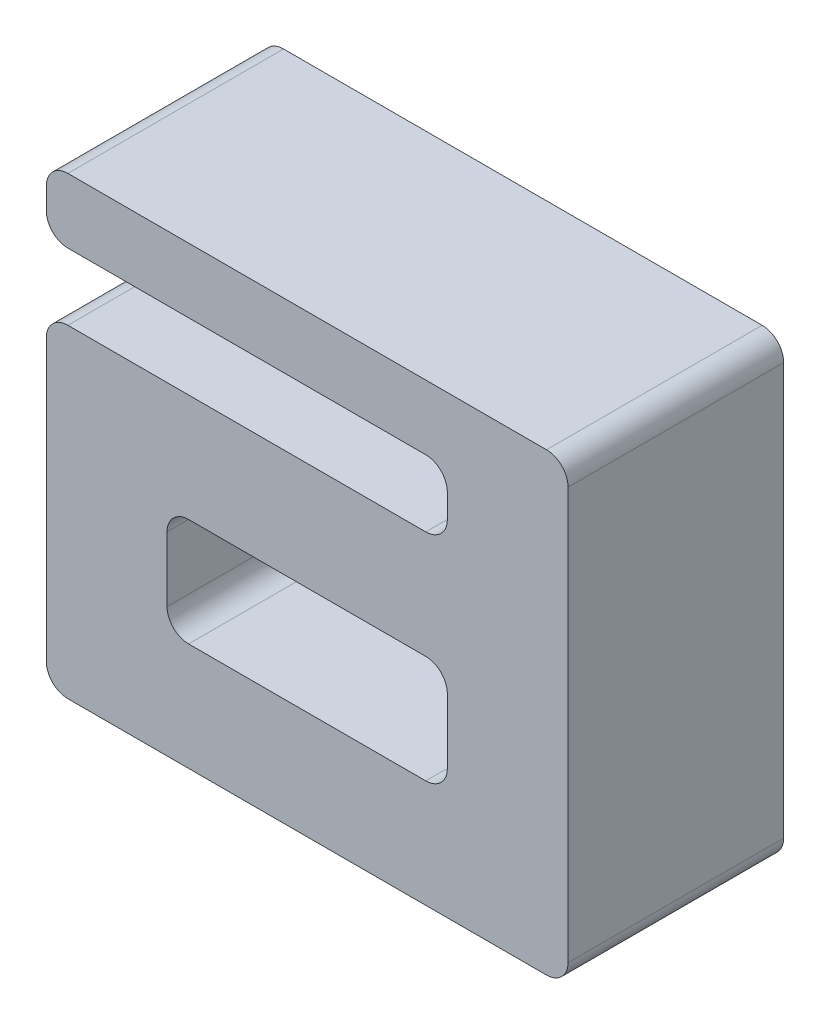
ISO-10303-21;
HEADER;
FILE_DESCRIPTION(('STEP AP214'),'2;1');
FILE_NAME('part.step','',(''),(''),'','','');
FILE_SCHEMA(('AUTOMOTIVE_DESIGN { 1 0 10303 214 1 1 1 1 }'));
ENDSEC;
DATA;
#1=APPLICATION_CONTEXT('core data for automotive mechanical design processes');
#2=APPLICATION_PROTOCOL_DEFINITION('international standard','automotive_design',2000,#1);
#3=PRODUCT_CONTEXT('',#1,'mechanical');
#4=PRODUCT('Part','Part','',(#3));
#5=PRODUCT_RELATED_PRODUCT_CATEGORY('part','',(#4));
#6=PRODUCT_DEFINITION_FORMATION('','',#4);
#7=PRODUCT_DEFINITION_CONTEXT('part definition',#1,'design');
#8=PRODUCT_DEFINITION('design','',#6,#7);
#9=PRODUCT_DEFINITION_SHAPE('','',#8);
#10=(LENGTH_UNIT() NAMED_UNIT(*) SI_UNIT(.MILLI.,.METRE.));
#11=(NAMED_UNIT(*) PLANE_ANGLE_UNIT() SI_UNIT($,.RADIAN.));
#12=(NAMED_UNIT(*) SI_UNIT($,.STERADIAN.) SOLID_ANGLE_UNIT());
#13=UNCERTAINTY_MEASURE_WITH_UNIT(LENGTH_MEASURE(1.E-05),#10,'distance_accuracy_value','');
#14=(GEOMETRIC_REPRESENTATION_CONTEXT(3) GLOBAL_UNCERTAINTY_ASSIGNED_CONTEXT((#13)) GLOBAL_UNIT_ASSIGNED_CONTEXT((#10,
#11,#12)) REPRESENTATION_CONTEXT('',''));
#15=CARTESIAN_POINT('',(0.,0.,0.));
#16=DIRECTION('',(0.,0.,1.));
#17=DIRECTION('',(1.,0.,0.));
#18=AXIS2_PLACEMENT_3D('',#15,#16,#17);
#19=CARTESIAN_POINT('',(0.,0.,5.));
#20=DIRECTION('',(0.,0.,-1.));
#21=DIRECTION('',(-1.,0.,0.));
#22=AXIS2_PLACEMENT_3D('',#19,#20,#21);
#23=PLANE('',#22);
#24=DIRECTION('',(0.,-1.,0.));
#25=VECTOR('',#24,1.);
#26=CARTESIAN_POINT('',(-6.05,-3.75,5.));
#27=LINE('',#26,#25);
#28=CARTESIAN_POINT('',(-6.05,3.25,5.));
#29=VERTEX_POINT('',#28);
#30=CARTESIAN_POINT('',(-6.05,-3.25,5.));
#31=VERTEX_POINT('',#30);
#32=EDGE_CURVE('E246',#29,#31,#27,.T.);
#33=ORIENTED_EDGE('',*,*,#32,.T.);
#34=CARTESIAN_POINT('',(-5.55,-3.25,5.));
#35=DIRECTION('',(0.,0.,-1.));
#36=DIRECTION('',(-1.,0.,0.));
#37=AXIS2_PLACEMENT_3D('',#34,#35,#36);
#38=CIRCLE('',#37,0.5);
#39=CARTESIAN_POINT('',(-5.55,-3.75,5.));
#40=VERTEX_POINT('',#39);
#41=EDGE_CURVE('E270',#31,#40,#38,.F.);
#42=ORIENTED_EDGE('',*,*,#41,.T.);
#43=DIRECTION('',(1.,0.,0.));
#44=VECTOR('',#43,1.);
#45=CARTESIAN_POINT('',(-6.05,-3.75,5.));
#46=LINE('',#45,#44);
#47=CARTESIAN_POINT('',(5.55,-3.75,5.));
#48=VERTEX_POINT('',#47);
#49=EDGE_CURVE('E215',#40,#48,#46,.T.);
#50=ORIENTED_EDGE('',*,*,#49,.T.);
#51=CARTESIAN_POINT('',(5.55,-3.25,5.));
#52=DIRECTION('',(0.,0.,-1.));
#53=DIRECTION('',(-1.,0.,0.));
#54=AXIS2_PLACEMENT_3D('',#51,#52,#53);
#55=CIRCLE('',#54,0.5);
#56=CARTESIAN_POINT('',(6.05,-3.25,5.));
#57=VERTEX_POINT('',#56);
#58=EDGE_CURVE('E268',#48,#57,#55,.F.);
#59=ORIENTED_EDGE('',*,*,#58,.T.);
#60=DIRECTION('',(0.,1.,0.));
#61=VECTOR('',#60,1.);
#62=CARTESIAN_POINT('',(6.05,-3.75,5.));
#63=LINE('',#62,#61);
#64=CARTESIAN_POINT('',(6.05,6.3,5.));
#65=VERTEX_POINT('',#64);
#66=EDGE_CURVE('E379',#57,#65,#63,.T.);
#67=ORIENTED_EDGE('',*,*,#66,.T.);
#68=CARTESIAN_POINT('',(5.55,6.3,5.));
#69=DIRECTION('',(0.,0.,-1.));
#70=DIRECTION('',(-1.,0.,0.));
#71=AXIS2_PLACEMENT_3D('',#68,#69,#70);
#72=CIRCLE('',#71,0.5);
#73=CARTESIAN_POINT('',(5.54999999999999,6.8,5.));
#74=VERTEX_POINT('',#73);
#75=EDGE_CURVE('E266',#65,#74,#72,.F.);
#76=ORIENTED_EDGE('',*,*,#75,.T.);
#77=DIRECTION('',(-1.,0.,0.));
#78=VECTOR('',#77,1.);
#79=CARTESIAN_POINT('',(-6.05,6.8,5.));
#80=LINE('',#79,#78);
#81=CARTESIAN_POINT('',(-5.55,6.8,5.));
#82=VERTEX_POINT('',#81);
#83=EDGE_CURVE('E382',#74,#82,#80,.T.);
#84=ORIENTED_EDGE('',*,*,#83,.T.);
#85=CARTESIAN_POINT('',(-5.55,6.3,5.));
#86=DIRECTION('',(0.,0.,-1.));
#87=DIRECTION('',(-1.,0.,0.));
#88=AXIS2_PLACEMENT_3D('',#85,#86,#87);
#89=CIRCLE('',#88,0.5);
#90=CARTESIAN_POINT('',(-6.05,6.3,5.));
#91=VERTEX_POINT('',#90);
#92=EDGE_CURVE('E264',#82,#91,#89,.F.);
#93=ORIENTED_EDGE('',*,*,#92,.T.);
#94=DIRECTION('',(0.,-1.,0.));
#95=VECTOR('',#94,1.);
#96=CARTESIAN_POINT('',(-6.05,5.3,5.));
#97=LINE('',#96,#95);
#98=CARTESIAN_POINT('',(-6.05,5.8,5.));
#99=VERTEX_POINT('',#98);
#100=EDGE_CURVE('E385',#91,#99,#97,.T.);
#101=ORIENTED_EDGE('',*,*,#100,.T.);
#102=CARTESIAN_POINT('',(-5.55,5.8,5.));
#103=DIRECTION('',(0.,0.,-1.));
#104=DIRECTION('',(-1.,0.,0.));
#105=AXIS2_PLACEMENT_3D('',#102,#103,#104);
#106=CIRCLE('',#105,0.5);
#107=CARTESIAN_POINT('',(-5.55,5.3,5.));
#108=VERTEX_POINT('',#107);
#109=EDGE_CURVE('E260',#99,#108,#106,.F.);
#110=ORIENTED_EDGE('',*,*,#109,.T.);
#111=DIRECTION('',(1.,0.,0.));
#112=VECTOR('',#111,1.);
#113=CARTESIAN_POINT('',(-6.05,5.3,5.));
#114=LINE('',#113,#112);
#115=CARTESIAN_POINT('',(2.75,5.3,5.));
#116=VERTEX_POINT('',#115);
#117=EDGE_CURVE('E388',#108,#116,#114,.T.);
#118=ORIENTED_EDGE('',*,*,#117,.T.);
#119=CARTESIAN_POINT('',(2.75,4.8,5.));
#120=DIRECTION('',(0.,0.,-1.));
#121=DIRECTION('',(-1.,0.,0.));
#122=AXIS2_PLACEMENT_3D('',#119,#120,#121);
#123=CIRCLE('',#122,0.5);
#124=CARTESIAN_POINT('',(3.25,4.8,5.));
#125=VERTEX_POINT('',#124);
#126=EDGE_CURVE('E327',#116,#125,#123,.T.);
#127=ORIENTED_EDGE('',*,*,#126,.T.);
#128=DIRECTION('',(0.,-1.,0.));
#129=VECTOR('',#128,1.);
#130=CARTESIAN_POINT('',(3.25,5.3,5.));
#131=LINE('',#130,#129);
#132=CARTESIAN_POINT('',(3.25,4.25,5.));
#133=VERTEX_POINT('',#132);
#134=EDGE_CURVE('E391',#125,#133,#131,.T.);
#135=ORIENTED_EDGE('',*,*,#134,.T.);
#136=CARTESIAN_POINT('',(2.75,4.25,5.));
#137=DIRECTION('',(0.,0.,-1.));
#138=DIRECTION('',(-1.,0.,0.));
#139=AXIS2_PLACEMENT_3D('',#136,#137,#138);
#140=CIRCLE('',#139,0.5);
#141=CARTESIAN_POINT('',(2.75,3.75,5.));
#142=VERTEX_POINT('',#141);
#143=EDGE_CURVE('E323',#133,#142,#140,.T.);
#144=ORIENTED_EDGE('',*,*,#143,.T.);
#145=DIRECTION('',(-1.,0.,0.));
#146=VECTOR('',#145,1.);
#147=CARTESIAN_POINT('',(-6.05,3.75,5.));
#148=LINE('',#147,#146);
#149=CARTESIAN_POINT('',(-5.55,3.75,5.));
#150=VERTEX_POINT('',#149);
#151=EDGE_CURVE('E247',#142,#150,#148,.T.);
#152=ORIENTED_EDGE('',*,*,#151,.T.);
#153=CARTESIAN_POINT('',(-5.55,3.25,5.));
#154=DIRECTION('',(0.,0.,-1.));
#155=DIRECTION('',(-1.,0.,0.));
#156=AXIS2_PLACEMENT_3D('',#153,#154,#155);
#157=CIRCLE('',#156,0.5);
#158=EDGE_CURVE('E262',#150,#29,#157,.F.);
#159=ORIENTED_EDGE('',*,*,#158,.T.);
#160=EDGE_LOOP('',(#33,#42,#50,#59,#67,#76,#84,#93,#101,#110,#118,#127,#135,#144,#152,#159));
#161=FACE_BOUND('',#160,.T.);
#162=DIRECTION('',(0.,-1.,0.));
#163=VECTOR('',#162,1.);
#164=CARTESIAN_POINT('',(-3.25,-1.25,5.));
#165=LINE('',#164,#163);
#166=CARTESIAN_POINT('',(-3.25,0.75,5.));
#167=VERTEX_POINT('',#166);
#168=CARTESIAN_POINT('',(-3.25,-0.75,5.));
#169=VERTEX_POINT('',#168);
#170=EDGE_CURVE('E360',#167,#169,#165,.T.);
#171=ORIENTED_EDGE('',*,*,#170,.F.);
#172=CARTESIAN_POINT('',(-2.75,0.75,5.));
#173=DIRECTION('',(0.,0.,-1.));
#174=DIRECTION('',(-1.,0.,0.));
#175=AXIS2_PLACEMENT_3D('',#172,#173,#174);
#176=CIRCLE('',#175,0.5);
#177=CARTESIAN_POINT('',(-2.75,1.25,5.));
#178=VERTEX_POINT('',#177);
#179=EDGE_CURVE('E11',#167,#178,#176,.T.);
#180=ORIENTED_EDGE('',*,*,#179,.T.);
#181=DIRECTION('',(-1.,0.,0.));
#182=VECTOR('',#181,1.);
#183=CARTESIAN_POINT('',(-3.25,1.25,5.));
#184=LINE('',#183,#182);
#185=CARTESIAN_POINT('',(2.75,1.25,5.));
#186=VERTEX_POINT('',#185);
#187=EDGE_CURVE('E228',#186,#178,#184,.T.);
#188=ORIENTED_EDGE('',*,*,#187,.F.);
#189=CARTESIAN_POINT('',(2.75,0.75,5.));
#190=DIRECTION('',(0.,0.,-1.));
#191=DIRECTION('',(-1.,0.,0.));
#192=AXIS2_PLACEMENT_3D('',#189,#190,#191);
#193=CIRCLE('',#192,0.5);
#194=CARTESIAN_POINT('',(3.25,0.75,5.));
#195=VERTEX_POINT('',#194);
#196=EDGE_CURVE('E331',#186,#195,#193,.T.);
#197=ORIENTED_EDGE('',*,*,#196,.T.);
#198=DIRECTION('',(0.,1.,0.));
#199=VECTOR('',#198,1.);
#200=CARTESIAN_POINT('',(3.25,-1.25,5.));
#201=LINE('',#200,#199);
#202=CARTESIAN_POINT('',(3.25,-0.75,5.));
#203=VERTEX_POINT('',#202);
#204=EDGE_CURVE('E364',#203,#195,#201,.T.);
#205=ORIENTED_EDGE('',*,*,#204,.F.);
#206=CARTESIAN_POINT('',(2.75,-0.75,5.));
#207=DIRECTION('',(0.,0.,-1.));
#208=DIRECTION('',(-1.,0.,0.));
#209=AXIS2_PLACEMENT_3D('',#206,#207,#208);
#210=CIRCLE('',#209,0.5);
#211=CARTESIAN_POINT('',(2.75,-1.25,5.));
#212=VERTEX_POINT('',#211);
#213=EDGE_CURVE('E48',#203,#212,#210,.T.);
#214=ORIENTED_EDGE('',*,*,#213,.T.);
#215=DIRECTION('',(1.,0.,0.));
#216=VECTOR('',#215,1.);
#217=CARTESIAN_POINT('',(-3.25,-1.25,5.));
#218=LINE('',#217,#216);
#219=CARTESIAN_POINT('',(-2.75,-1.25,5.));
#220=VERTEX_POINT('',#219);
#221=EDGE_CURVE('E367',#220,#212,#218,.T.);
#222=ORIENTED_EDGE('',*,*,#221,.F.);
#223=CARTESIAN_POINT('',(-2.75,-0.75,5.));
#224=DIRECTION('',(0.,0.,-1.));
#225=DIRECTION('',(-1.,0.,0.));
#226=AXIS2_PLACEMENT_3D('',#223,#224,#225);
#227=CIRCLE('',#226,0.5);
#228=EDGE_CURVE('E338',#220,#169,#227,.T.);
#229=ORIENTED_EDGE('',*,*,#228,.T.);
#230=EDGE_LOOP('',(#171,#180,#188,#197,#205,#214,#222,#229));
#231=FACE_BOUND('',#230,.T.);
#232=ADVANCED_FACE('F33',(#161,#231),#23,.F.);
#233=CARTESIAN_POINT('',(0.,0.,0.));
#234=DIRECTION('',(0.,0.,-1.));
#235=DIRECTION('',(-1.,0.,0.));
#236=AXIS2_PLACEMENT_3D('',#233,#234,#235);
#237=PLANE('',#236);
#238=DIRECTION('',(1.,0.,0.));
#239=VECTOR('',#238,1.);
#240=CARTESIAN_POINT('',(-6.05,-3.75,0.));
#241=LINE('',#240,#239);
#242=CARTESIAN_POINT('',(-5.55,-3.75,0.));
#243=VERTEX_POINT('',#242);
#244=CARTESIAN_POINT('',(5.55,-3.75,0.));
#245=VERTEX_POINT('',#244);
#246=EDGE_CURVE('E212',#243,#245,#241,.T.);
#247=ORIENTED_EDGE('',*,*,#246,.F.);
#248=CARTESIAN_POINT('',(-5.55,-3.25,0.));
#249=DIRECTION('',(0.,0.,-1.));
#250=DIRECTION('',(-1.,0.,0.));
#251=AXIS2_PLACEMENT_3D('',#248,#249,#250);
#252=CIRCLE('',#251,0.5);
#253=CARTESIAN_POINT('',(-6.05,-3.25,0.));
#254=VERTEX_POINT('',#253);
#255=EDGE_CURVE('E195',#243,#254,#252,.T.);
#256=ORIENTED_EDGE('',*,*,#255,.T.);
#257=DIRECTION('',(0.,-1.,0.));
#258=VECTOR('',#257,1.);
#259=CARTESIAN_POINT('',(-6.05,-3.75,0.));
#260=LINE('',#259,#258);
#261=CARTESIAN_POINT('',(-6.05,3.25,0.));
#262=VERTEX_POINT('',#261);
#263=EDGE_CURVE('E223',#262,#254,#260,.T.);
#264=ORIENTED_EDGE('',*,*,#263,.F.);
#265=CARTESIAN_POINT('',(-5.55,3.25,0.));
#266=DIRECTION('',(0.,0.,-1.));
#267=DIRECTION('',(-1.,0.,0.));
#268=AXIS2_PLACEMENT_3D('',#265,#266,#267);
#269=CIRCLE('',#268,0.5);
#270=CARTESIAN_POINT('',(-5.55,3.75,0.));
#271=VERTEX_POINT('',#270);
#272=EDGE_CURVE('E250',#262,#271,#269,.T.);
#273=ORIENTED_EDGE('',*,*,#272,.T.);
#274=DIRECTION('',(-1.,0.,0.));
#275=VECTOR('',#274,1.);
#276=CARTESIAN_POINT('',(-6.05,3.75,0.));
#277=LINE('',#276,#275);
#278=CARTESIAN_POINT('',(2.75,3.75,0.));
#279=VERTEX_POINT('',#278);
#280=EDGE_CURVE('E243',#279,#271,#277,.T.);
#281=ORIENTED_EDGE('',*,*,#280,.F.);
#282=CARTESIAN_POINT('',(2.75,4.25,0.));
#283=DIRECTION('',(0.,0.,-1.));
#284=DIRECTION('',(-1.,0.,0.));
#285=AXIS2_PLACEMENT_3D('',#282,#283,#284);
#286=CIRCLE('',#285,0.5);
#287=CARTESIAN_POINT('',(3.25,4.25,0.));
#288=VERTEX_POINT('',#287);
#289=EDGE_CURVE('E321',#279,#288,#286,.F.);
#290=ORIENTED_EDGE('',*,*,#289,.T.);
#291=DIRECTION('',(0.,-1.,0.));
#292=VECTOR('',#291,1.);
#293=CARTESIAN_POINT('',(3.25,5.3,0.));
#294=LINE('',#293,#292);
#295=CARTESIAN_POINT('',(3.25,4.8,0.));
#296=VERTEX_POINT('',#295);
#297=EDGE_CURVE('E240',#296,#288,#294,.T.);
#298=ORIENTED_EDGE('',*,*,#297,.F.);
#299=CARTESIAN_POINT('',(2.75,4.8,0.));
#300=DIRECTION('',(0.,0.,-1.));
#301=DIRECTION('',(-1.,0.,0.));
#302=AXIS2_PLACEMENT_3D('',#299,#300,#301);
#303=CIRCLE('',#302,0.5);
#304=CARTESIAN_POINT('',(2.75,5.3,0.));
#305=VERTEX_POINT('',#304);
#306=EDGE_CURVE('E325',#296,#305,#303,.F.);
#307=ORIENTED_EDGE('',*,*,#306,.T.);
#308=DIRECTION('',(1.,0.,0.));
#309=VECTOR('',#308,1.);
#310=CARTESIAN_POINT('',(-6.05,5.3,0.));
#311=LINE('',#310,#309);
#312=CARTESIAN_POINT('',(-5.55,5.3,0.));
#313=VERTEX_POINT('',#312);
#314=EDGE_CURVE('E237',#313,#305,#311,.T.);
#315=ORIENTED_EDGE('',*,*,#314,.F.);
#316=CARTESIAN_POINT('',(-5.55,5.8,0.));
#317=DIRECTION('',(0.,0.,-1.));
#318=DIRECTION('',(-1.,0.,0.));
#319=AXIS2_PLACEMENT_3D('',#316,#317,#318);
#320=CIRCLE('',#319,0.5);
#321=CARTESIAN_POINT('',(-6.05,5.8,0.));
#322=VERTEX_POINT('',#321);
#323=EDGE_CURVE('E216',#313,#322,#320,.T.);
#324=ORIENTED_EDGE('',*,*,#323,.T.);
#325=DIRECTION('',(0.,-1.,0.));
#326=VECTOR('',#325,1.);
#327=CARTESIAN_POINT('',(-6.05,5.3,0.));
#328=LINE('',#327,#326);
#329=CARTESIAN_POINT('',(-6.05,6.3,0.));
#330=VERTEX_POINT('',#329);
#331=EDGE_CURVE('E234',#330,#322,#328,.T.);
#332=ORIENTED_EDGE('',*,*,#331,.F.);
#333=CARTESIAN_POINT('',(-5.55,6.3,0.));
#334=DIRECTION('',(0.,0.,-1.));
#335=DIRECTION('',(-1.,0.,0.));
#336=AXIS2_PLACEMENT_3D('',#333,#334,#335);
#337=CIRCLE('',#336,0.5);
#338=CARTESIAN_POINT('',(-5.55,6.8,0.));
#339=VERTEX_POINT('',#338);
#340=EDGE_CURVE('E252',#330,#339,#337,.T.);
#341=ORIENTED_EDGE('',*,*,#340,.T.);
#342=DIRECTION('',(-1.,0.,0.));
#343=VECTOR('',#342,1.);
#344=CARTESIAN_POINT('',(-6.05,6.8,0.));
#345=LINE('',#344,#343);
#346=CARTESIAN_POINT('',(5.54999999999999,6.8,0.));
#347=VERTEX_POINT('',#346);
#348=EDGE_CURVE('E226',#347,#339,#345,.T.);
#349=ORIENTED_EDGE('',*,*,#348,.F.);
#350=CARTESIAN_POINT('',(5.55,6.3,0.));
#351=DIRECTION('',(0.,0.,-1.));
#352=DIRECTION('',(-1.,0.,0.));
#353=AXIS2_PLACEMENT_3D('',#350,#351,#352);
#354=CIRCLE('',#353,0.5);
#355=CARTESIAN_POINT('',(6.05,6.3,0.));
#356=VERTEX_POINT('',#355);
#357=EDGE_CURVE('E254',#347,#356,#354,.T.);
#358=ORIENTED_EDGE('',*,*,#357,.T.);
#359=DIRECTION('',(0.,1.,0.));
#360=VECTOR('',#359,1.);
#361=CARTESIAN_POINT('',(6.05,-3.75,0.));
#362=LINE('',#361,#360);
#363=CARTESIAN_POINT('',(6.05,-3.25,0.));
#364=VERTEX_POINT('',#363);
#365=EDGE_CURVE('E222',#364,#356,#362,.T.);
#366=ORIENTED_EDGE('',*,*,#365,.F.);
#367=CARTESIAN_POINT('',(5.55,-3.25,0.));
#368=DIRECTION('',(0.,0.,-1.));
#369=DIRECTION('',(-1.,0.,0.));
#370=AXIS2_PLACEMENT_3D('',#367,#368,#369);
#371=CIRCLE('',#370,0.5);
#372=EDGE_CURVE('E206',#364,#245,#371,.T.);
#373=ORIENTED_EDGE('',*,*,#372,.T.);
#374=EDGE_LOOP('',(#247,#256,#264,#273,#281,#290,#298,#307,#315,#324,#332,#341,#349,#358,#366,#373));
#375=FACE_BOUND('',#374,.T.);
#376=DIRECTION('',(0.,1.,0.));
#377=VECTOR('',#376,1.);
#378=CARTESIAN_POINT('',(3.25,-1.25,0.));
#379=LINE('',#378,#377);
#380=CARTESIAN_POINT('',(3.25,-0.75,0.));
#381=VERTEX_POINT('',#380);
#382=CARTESIAN_POINT('',(3.25,0.75,0.));
#383=VERTEX_POINT('',#382);
#384=EDGE_CURVE('E373',#381,#383,#379,.T.);
#385=ORIENTED_EDGE('',*,*,#384,.T.);
#386=CARTESIAN_POINT('',(2.75,0.75,0.));
#387=DIRECTION('',(0.,0.,-1.));
#388=DIRECTION('',(-1.,0.,0.));
#389=AXIS2_PLACEMENT_3D('',#386,#387,#388);
#390=CIRCLE('',#389,0.5);
#391=CARTESIAN_POINT('',(2.75,1.25,0.));
#392=VERTEX_POINT('',#391);
#393=EDGE_CURVE('E329',#383,#392,#390,.F.);
#394=ORIENTED_EDGE('',*,*,#393,.T.);
#395=DIRECTION('',(-1.,0.,0.));
#396=VECTOR('',#395,1.);
#397=CARTESIAN_POINT('',(-3.25,1.25,0.));
#398=LINE('',#397,#396);
#399=CARTESIAN_POINT('',(-2.75,1.25,0.));
#400=VERTEX_POINT('',#399);
#401=EDGE_CURVE('E345',#392,#400,#398,.T.);
#402=ORIENTED_EDGE('',*,*,#401,.T.);
#403=CARTESIAN_POINT('',(-2.75,0.75,0.));
#404=DIRECTION('',(0.,0.,-1.));
#405=DIRECTION('',(-1.,0.,0.));
#406=AXIS2_PLACEMENT_3D('',#403,#404,#405);
#407=CIRCLE('',#406,0.5);
#408=CARTESIAN_POINT('',(-3.25,0.75,0.));
#409=VERTEX_POINT('',#408);
#410=EDGE_CURVE('E41',#400,#409,#407,.F.);
#411=ORIENTED_EDGE('',*,*,#410,.T.);
#412=DIRECTION('',(0.,-1.,0.));
#413=VECTOR('',#412,1.);
#414=CARTESIAN_POINT('',(-3.25,-1.25,0.));
#415=LINE('',#414,#413);
#416=CARTESIAN_POINT('',(-3.25,-0.75,0.));
#417=VERTEX_POINT('',#416);
#418=EDGE_CURVE('E343',#409,#417,#415,.T.);
#419=ORIENTED_EDGE('',*,*,#418,.T.);
#420=CARTESIAN_POINT('',(-2.75,-0.75,0.));
#421=DIRECTION('',(0.,0.,-1.));
#422=DIRECTION('',(-1.,0.,0.));
#423=AXIS2_PLACEMENT_3D('',#420,#421,#422);
#424=CIRCLE('',#423,0.5);
#425=CARTESIAN_POINT('',(-2.75,-1.25,0.));
#426=VERTEX_POINT('',#425);
#427=EDGE_CURVE('E336',#417,#426,#424,.F.);
#428=ORIENTED_EDGE('',*,*,#427,.T.);
#429=DIRECTION('',(1.,0.,0.));
#430=VECTOR('',#429,1.);
#431=CARTESIAN_POINT('',(-3.25,-1.25,0.));
#432=LINE('',#431,#430);
#433=CARTESIAN_POINT('',(2.75,-1.25,0.));
#434=VERTEX_POINT('',#433);
#435=EDGE_CURVE('E354',#426,#434,#432,.T.);
#436=ORIENTED_EDGE('',*,*,#435,.T.);
#437=CARTESIAN_POINT('',(2.75,-0.75,0.));
#438=DIRECTION('',(0.,0.,-1.));
#439=DIRECTION('',(-1.,0.,0.));
#440=AXIS2_PLACEMENT_3D('',#437,#438,#439);
#441=CIRCLE('',#440,0.5);
#442=EDGE_CURVE('E333',#434,#381,#441,.F.);
#443=ORIENTED_EDGE('',*,*,#442,.T.);
#444=EDGE_LOOP('',(#385,#394,#402,#411,#419,#428,#436,#443));
#445=FACE_BOUND('',#444,.T.);
#446=ADVANCED_FACE('F219',(#375,#445),#237,.T.);
#447=CARTESIAN_POINT('',(-6.05,-3.75,5.));
#448=DIRECTION('',(1.,0.,0.));
#449=DIRECTION('',(0.,0.,-1.));
#450=AXIS2_PLACEMENT_3D('',#447,#448,#449);
#451=PLANE('',#450);
#452=ORIENTED_EDGE('',*,*,#263,.T.);
#453=DIRECTION('',(0.,0.,-1.));
#454=VECTOR('',#453,1.);
#455=CARTESIAN_POINT('',(-6.05,-3.25,5.));
#456=LINE('',#455,#454);
#457=EDGE_CURVE('E200',#254,#31,#456,.F.);
#458=ORIENTED_EDGE('',*,*,#457,.T.);
#459=ORIENTED_EDGE('',*,*,#32,.F.);
#460=DIRECTION('',(0.,0.,-1.));
#461=VECTOR('',#460,1.);
#462=CARTESIAN_POINT('',(-6.05,3.25,5.));
#463=LINE('',#462,#461);
#464=EDGE_CURVE('E205',#29,#262,#463,.T.);
#465=ORIENTED_EDGE('',*,*,#464,.T.);
#466=EDGE_LOOP('',(#452,#458,#459,#465));
#467=FACE_BOUND('',#466,.T.);
#468=ADVANCED_FACE('F406',(#467),#451,.F.);
#469=CARTESIAN_POINT('',(-6.05,-3.75,5.));
#470=DIRECTION('',(0.,1.,0.));
#471=DIRECTION('',(-1.,0.,0.));
#472=AXIS2_PLACEMENT_3D('',#469,#470,#471);
#473=PLANE('',#472);
#474=ORIENTED_EDGE('',*,*,#49,.F.);
#475=DIRECTION('',(0.,0.,-1.));
#476=VECTOR('',#475,1.);
#477=CARTESIAN_POINT('',(-5.55,-3.75,5.));
#478=LINE('',#477,#476);
#479=EDGE_CURVE('E199',#40,#243,#478,.T.);
#480=ORIENTED_EDGE('',*,*,#479,.T.);
#481=ORIENTED_EDGE('',*,*,#246,.T.);
#482=DIRECTION('',(0.,0.,-1.));
#483=VECTOR('',#482,1.);
#484=CARTESIAN_POINT('',(5.55,-3.75,5.));
#485=LINE('',#484,#483);
#486=EDGE_CURVE('E217',#245,#48,#485,.F.);
#487=ORIENTED_EDGE('',*,*,#486,.T.);
#488=EDGE_LOOP('',(#474,#480,#481,#487));
#489=FACE_BOUND('',#488,.T.);
#490=ADVANCED_FACE('F211',(#489),#473,.F.);
#491=CARTESIAN_POINT('',(6.05,-3.75,5.));
#492=DIRECTION('',(-1.,0.,0.));
#493=DIRECTION('',(0.,-1.,0.));
#494=AXIS2_PLACEMENT_3D('',#491,#492,#493);
#495=PLANE('',#494);
#496=ORIENTED_EDGE('',*,*,#66,.F.);
#497=DIRECTION('',(0.,0.,-1.));
#498=VECTOR('',#497,1.);
#499=CARTESIAN_POINT('',(6.05,-3.25,5.));
#500=LINE('',#499,#498);
#501=EDGE_CURVE('E274',#57,#364,#500,.T.);
#502=ORIENTED_EDGE('',*,*,#501,.T.);
#503=ORIENTED_EDGE('',*,*,#365,.T.);
#504=DIRECTION('',(0.,0.,-1.));
#505=VECTOR('',#504,1.);
#506=CARTESIAN_POINT('',(6.05,6.3,5.));
#507=LINE('',#506,#505);
#508=EDGE_CURVE('E272',#356,#65,#507,.F.);
#509=ORIENTED_EDGE('',*,*,#508,.T.);
#510=EDGE_LOOP('',(#496,#502,#503,#509));
#511=FACE_BOUND('',#510,.T.);
#512=ADVANCED_FACE('F450',(#511),#495,.F.);
#513=CARTESIAN_POINT('',(-6.05,6.8,5.));
#514=DIRECTION('',(0.,-1.,0.));
#515=DIRECTION('',(1.,0.,0.));
#516=AXIS2_PLACEMENT_3D('',#513,#514,#515);
#517=PLANE('',#516);
#518=ORIENTED_EDGE('',*,*,#83,.F.);
#519=DIRECTION('',(0.,0.,-1.));
#520=VECTOR('',#519,1.);
#521=CARTESIAN_POINT('',(5.55,6.8,5.));
#522=LINE('',#521,#520);
#523=EDGE_CURVE('E279',#74,#347,#522,.T.);
#524=ORIENTED_EDGE('',*,*,#523,.T.);
#525=ORIENTED_EDGE('',*,*,#348,.T.);
#526=DIRECTION('',(0.,0.,-1.));
#527=VECTOR('',#526,1.);
#528=CARTESIAN_POINT('',(-5.55,6.8,5.));
#529=LINE('',#528,#527);
#530=EDGE_CURVE('E277',#339,#82,#529,.F.);
#531=ORIENTED_EDGE('',*,*,#530,.T.);
#532=EDGE_LOOP('',(#518,#524,#525,#531));
#533=FACE_BOUND('',#532,.T.);
#534=ADVANCED_FACE('F442',(#533),#517,.F.);
#535=CARTESIAN_POINT('',(-6.05,5.3,5.));
#536=DIRECTION('',(1.,0.,0.));
#537=DIRECTION('',(0.,1.,0.));
#538=AXIS2_PLACEMENT_3D('',#535,#536,#537);
#539=PLANE('',#538);
#540=ORIENTED_EDGE('',*,*,#100,.F.);
#541=DIRECTION('',(0.,0.,-1.));
#542=VECTOR('',#541,1.);
#543=CARTESIAN_POINT('',(-6.05,6.3,5.));
#544=LINE('',#543,#542);
#545=EDGE_CURVE('E284',#91,#330,#544,.T.);
#546=ORIENTED_EDGE('',*,*,#545,.T.);
#547=ORIENTED_EDGE('',*,*,#331,.T.);
#548=DIRECTION('',(0.,0.,-1.));
#549=VECTOR('',#548,1.);
#550=CARTESIAN_POINT('',(-6.05,5.8,5.));
#551=LINE('',#550,#549);
#552=EDGE_CURVE('E282',#322,#99,#551,.F.);
#553=ORIENTED_EDGE('',*,*,#552,.T.);
#554=EDGE_LOOP('',(#540,#546,#547,#553));
#555=FACE_BOUND('',#554,.T.);
#556=ADVANCED_FACE('F433',(#555),#539,.F.);
#557=CARTESIAN_POINT('',(-6.05,5.3,5.));
#558=DIRECTION('',(0.,1.,0.));
#559=DIRECTION('',(0.,0.,1.));
#560=AXIS2_PLACEMENT_3D('',#557,#558,#559);
#561=PLANE('',#560);
#562=ORIENTED_EDGE('',*,*,#117,.F.);
#563=DIRECTION('',(0.,0.,-1.));
#564=VECTOR('',#563,1.);
#565=CARTESIAN_POINT('',(-5.55,5.3,5.));
#566=LINE('',#565,#564);
#567=EDGE_CURVE('E294',#108,#313,#566,.T.);
#568=ORIENTED_EDGE('',*,*,#567,.T.);
#569=ORIENTED_EDGE('',*,*,#314,.T.);
#570=DIRECTION('',(0.,0.,-1.));
#571=VECTOR('',#570,1.);
#572=CARTESIAN_POINT('',(2.75,5.3,5.));
#573=LINE('',#572,#571);
#574=EDGE_CURVE('E292',#305,#116,#573,.F.);
#575=ORIENTED_EDGE('',*,*,#574,.T.);
#576=EDGE_LOOP('',(#562,#568,#569,#575));
#577=FACE_BOUND('',#576,.T.);
#578=ADVANCED_FACE('F424',(#577),#561,.F.);
#579=CARTESIAN_POINT('',(3.25,5.3,5.));
#580=DIRECTION('',(1.,0.,0.));
#581=DIRECTION('',(0.,1.,0.));
#582=AXIS2_PLACEMENT_3D('',#579,#580,#581);
#583=PLANE('',#582);
#584=ORIENTED_EDGE('',*,*,#297,.T.);
#585=DIRECTION('',(0.,0.,-1.));
#586=VECTOR('',#585,1.);
#587=CARTESIAN_POINT('',(3.25,4.25,5.));
#588=LINE('',#587,#586);
#589=EDGE_CURVE('E300',#288,#133,#588,.F.);
#590=ORIENTED_EDGE('',*,*,#589,.T.);
#591=ORIENTED_EDGE('',*,*,#134,.F.);
#592=DIRECTION('',(0.,0.,-1.));
#593=VECTOR('',#592,1.);
#594=CARTESIAN_POINT('',(3.25,4.8,0.));
#595=LINE('',#594,#593);
#596=EDGE_CURVE('E297',#125,#296,#595,.T.);
#597=ORIENTED_EDGE('',*,*,#596,.T.);
#598=EDGE_LOOP('',(#584,#590,#591,#597));
#599=FACE_BOUND('',#598,.T.);
#600=ADVANCED_FACE('F414',(#599),#583,.F.);
#601=CARTESIAN_POINT('',(-6.05,3.75,5.));
#602=DIRECTION('',(0.,-1.,0.));
#603=DIRECTION('',(0.,0.,-1.));
#604=AXIS2_PLACEMENT_3D('',#601,#602,#603);
#605=PLANE('',#604);
#606=ORIENTED_EDGE('',*,*,#280,.T.);
#607=DIRECTION('',(0.,0.,-1.));
#608=VECTOR('',#607,1.);
#609=CARTESIAN_POINT('',(-5.55,3.75,5.));
#610=LINE('',#609,#608);
#611=EDGE_CURVE('E290',#271,#150,#610,.F.);
#612=ORIENTED_EDGE('',*,*,#611,.T.);
#613=ORIENTED_EDGE('',*,*,#151,.F.);
#614=DIRECTION('',(0.,0.,-1.));
#615=VECTOR('',#614,1.);
#616=CARTESIAN_POINT('',(2.75,3.75,0.));
#617=LINE('',#616,#615);
#618=EDGE_CURVE('E287',#142,#279,#617,.T.);
#619=ORIENTED_EDGE('',*,*,#618,.T.);
#620=EDGE_LOOP('',(#606,#612,#613,#619));
#621=FACE_BOUND('',#620,.T.);
#622=ADVANCED_FACE('F408',(#621),#605,.F.);
#623=CARTESIAN_POINT('',(-3.25,-1.25,5.));
#624=DIRECTION('',(1.,0.,0.));
#625=DIRECTION('',(0.,0.,-1.));
#626=AXIS2_PLACEMENT_3D('',#623,#624,#625);
#627=PLANE('',#626);
#628=ORIENTED_EDGE('',*,*,#170,.T.);
#629=DIRECTION('',(0.,0.,-1.));
#630=VECTOR('',#629,1.);
#631=CARTESIAN_POINT('',(-3.25,-0.75,0.));
#632=LINE('',#631,#630);
#633=EDGE_CURVE('E318',#169,#417,#632,.T.);
#634=ORIENTED_EDGE('',*,*,#633,.T.);
#635=ORIENTED_EDGE('',*,*,#418,.F.);
#636=DIRECTION('',(0.,0.,-1.));
#637=VECTOR('',#636,1.);
#638=CARTESIAN_POINT('',(-3.25,0.75,5.));
#639=LINE('',#638,#637);
#640=EDGE_CURVE('E316',#409,#167,#639,.F.);
#641=ORIENTED_EDGE('',*,*,#640,.T.);
#642=EDGE_LOOP('',(#628,#634,#635,#641));
#643=FACE_BOUND('',#642,.T.);
#644=ADVANCED_FACE('F351',(#643),#627,.T.);
#645=CARTESIAN_POINT('',(-3.25,-1.25,5.));
#646=DIRECTION('',(0.,1.,0.));
#647=DIRECTION('',(0.,0.,1.));
#648=AXIS2_PLACEMENT_3D('',#645,#646,#647);
#649=PLANE('',#648);
#650=ORIENTED_EDGE('',*,*,#221,.T.);
#651=DIRECTION('',(0.,0.,-1.));
#652=VECTOR('',#651,1.);
#653=CARTESIAN_POINT('',(2.75,-1.25,0.));
#654=LINE('',#653,#652);
#655=EDGE_CURVE('E313',#212,#434,#654,.T.);
#656=ORIENTED_EDGE('',*,*,#655,.T.);
#657=ORIENTED_EDGE('',*,*,#435,.F.);
#658=DIRECTION('',(0.,0.,-1.));
#659=VECTOR('',#658,1.);
#660=CARTESIAN_POINT('',(-2.75,-1.25,5.));
#661=LINE('',#660,#659);
#662=EDGE_CURVE('E55',#426,#220,#661,.F.);
#663=ORIENTED_EDGE('',*,*,#662,.T.);
#664=EDGE_LOOP('',(#650,#656,#657,#663));
#665=FACE_BOUND('',#664,.T.);
#666=ADVANCED_FACE('F525',(#665),#649,.T.);
#667=CARTESIAN_POINT('',(3.25,-1.25,5.));
#668=DIRECTION('',(-1.,0.,0.));
#669=DIRECTION('',(0.,0.,1.));
#670=AXIS2_PLACEMENT_3D('',#667,#668,#669);
#671=PLANE('',#670);
#672=ORIENTED_EDGE('',*,*,#204,.T.);
#673=DIRECTION('',(0.,0.,-1.));
#674=VECTOR('',#673,1.);
#675=CARTESIAN_POINT('',(3.25,0.75,0.));
#676=LINE('',#675,#674);
#677=EDGE_CURVE('E304',#195,#383,#676,.T.);
#678=ORIENTED_EDGE('',*,*,#677,.T.);
#679=ORIENTED_EDGE('',*,*,#384,.F.);
#680=DIRECTION('',(0.,0.,-1.));
#681=VECTOR('',#680,1.);
#682=CARTESIAN_POINT('',(3.25,-0.75,5.));
#683=LINE('',#682,#681);
#684=EDGE_CURVE('E302',#381,#203,#683,.F.);
#685=ORIENTED_EDGE('',*,*,#684,.T.);
#686=EDGE_LOOP('',(#672,#678,#679,#685));
#687=FACE_BOUND('',#686,.T.);
#688=ADVANCED_FACE('F531',(#687),#671,.T.);
#689=CARTESIAN_POINT('',(-3.25,1.25,5.));
#690=DIRECTION('',(0.,-1.,0.));
#691=DIRECTION('',(0.,0.,-1.));
#692=AXIS2_PLACEMENT_3D('',#689,#690,#691);
#693=PLANE('',#692);
#694=ORIENTED_EDGE('',*,*,#401,.F.);
#695=DIRECTION('',(0.,0.,-1.));
#696=VECTOR('',#695,1.);
#697=CARTESIAN_POINT('',(2.75,1.25,5.));
#698=LINE('',#697,#696);
#699=EDGE_CURVE('E310',#392,#186,#698,.F.);
#700=ORIENTED_EDGE('',*,*,#699,.T.);
#701=ORIENTED_EDGE('',*,*,#187,.T.);
#702=DIRECTION('',(0.,0.,-1.));
#703=VECTOR('',#702,1.);
#704=CARTESIAN_POINT('',(-2.75,1.25,0.));
#705=LINE('',#704,#703);
#706=EDGE_CURVE('E307',#178,#400,#705,.T.);
#707=ORIENTED_EDGE('',*,*,#706,.T.);
#708=EDGE_LOOP('',(#694,#700,#701,#707));
#709=FACE_BOUND('',#708,.T.);
#710=ADVANCED_FACE('F362',(#709),#693,.T.);
#711=CARTESIAN_POINT('',(-5.55,-3.25,5.));
#712=DIRECTION('',(0.,0.,-1.));
#713=DIRECTION('',(-1.,0.,0.));
#714=AXIS2_PLACEMENT_3D('',#711,#712,#713);
#715=CYLINDRICAL_SURFACE('',#714,0.5);
#716=ORIENTED_EDGE('',*,*,#41,.F.);
#717=ORIENTED_EDGE('',*,*,#457,.F.);
#718=ORIENTED_EDGE('',*,*,#255,.F.);
#719=ORIENTED_EDGE('',*,*,#479,.F.);
#720=EDGE_LOOP('',(#716,#717,#718,#719));
#721=FACE_BOUND('',#720,.T.);
#722=ADVANCED_FACE('F198',(#721),#715,.T.);
#723=CARTESIAN_POINT('',(5.55,-3.25,5.));
#724=DIRECTION('',(0.,0.,-1.));
#725=DIRECTION('',(-1.,0.,0.));
#726=AXIS2_PLACEMENT_3D('',#723,#724,#725);
#727=CYLINDRICAL_SURFACE('',#726,0.5);
#728=ORIENTED_EDGE('',*,*,#58,.F.);
#729=ORIENTED_EDGE('',*,*,#486,.F.);
#730=ORIENTED_EDGE('',*,*,#372,.F.);
#731=ORIENTED_EDGE('',*,*,#501,.F.);
#732=EDGE_LOOP('',(#728,#729,#730,#731));
#733=FACE_BOUND('',#732,.T.);
#734=ADVANCED_FACE('F454',(#733),#727,.T.);
#735=CARTESIAN_POINT('',(5.55,6.3,5.));
#736=DIRECTION('',(0.,0.,-1.));
#737=DIRECTION('',(-1.,0.,0.));
#738=AXIS2_PLACEMENT_3D('',#735,#736,#737);
#739=CYLINDRICAL_SURFACE('',#738,0.5);
#740=ORIENTED_EDGE('',*,*,#75,.F.);
#741=ORIENTED_EDGE('',*,*,#508,.F.);
#742=ORIENTED_EDGE('',*,*,#357,.F.);
#743=ORIENTED_EDGE('',*,*,#523,.F.);
#744=EDGE_LOOP('',(#740,#741,#742,#743));
#745=FACE_BOUND('',#744,.T.);
#746=ADVANCED_FACE('F446',(#745),#739,.T.);
#747=CARTESIAN_POINT('',(-5.55,6.3,5.));
#748=DIRECTION('',(0.,0.,-1.));
#749=DIRECTION('',(-1.,0.,0.));
#750=AXIS2_PLACEMENT_3D('',#747,#748,#749);
#751=CYLINDRICAL_SURFACE('',#750,0.5);
#752=ORIENTED_EDGE('',*,*,#92,.F.);
#753=ORIENTED_EDGE('',*,*,#530,.F.);
#754=ORIENTED_EDGE('',*,*,#340,.F.);
#755=ORIENTED_EDGE('',*,*,#545,.F.);
#756=EDGE_LOOP('',(#752,#753,#754,#755));
#757=FACE_BOUND('',#756,.T.);
#758=ADVANCED_FACE('F437',(#757),#751,.T.);
#759=CARTESIAN_POINT('',(-5.55,3.25,5.));
#760=DIRECTION('',(0.,0.,-1.));
#761=DIRECTION('',(-1.,0.,0.));
#762=AXIS2_PLACEMENT_3D('',#759,#760,#761);
#763=CYLINDRICAL_SURFACE('',#762,0.5);
#764=ORIENTED_EDGE('',*,*,#158,.F.);
#765=ORIENTED_EDGE('',*,*,#611,.F.);
#766=ORIENTED_EDGE('',*,*,#272,.F.);
#767=ORIENTED_EDGE('',*,*,#464,.F.);
#768=EDGE_LOOP('',(#764,#765,#766,#767));
#769=FACE_BOUND('',#768,.T.);
#770=ADVANCED_FACE('F404',(#769),#763,.T.);
#771=CARTESIAN_POINT('',(-5.55,5.8,5.));
#772=DIRECTION('',(0.,0.,-1.));
#773=DIRECTION('',(-1.,0.,0.));
#774=AXIS2_PLACEMENT_3D('',#771,#772,#773);
#775=CYLINDRICAL_SURFACE('',#774,0.5);
#776=ORIENTED_EDGE('',*,*,#109,.F.);
#777=ORIENTED_EDGE('',*,*,#552,.F.);
#778=ORIENTED_EDGE('',*,*,#323,.F.);
#779=ORIENTED_EDGE('',*,*,#567,.F.);
#780=EDGE_LOOP('',(#776,#777,#778,#779));
#781=FACE_BOUND('',#780,.T.);
#782=ADVANCED_FACE('F428',(#781),#775,.T.);
#783=CARTESIAN_POINT('',(2.75,4.25,5.));
#784=DIRECTION('',(0.,0.,1.));
#785=DIRECTION('',(1.,0.,0.));
#786=AXIS2_PLACEMENT_3D('',#783,#784,#785);
#787=CYLINDRICAL_SURFACE('',#786,0.5);
#788=ORIENTED_EDGE('',*,*,#143,.F.);
#789=ORIENTED_EDGE('',*,*,#589,.F.);
#790=ORIENTED_EDGE('',*,*,#289,.F.);
#791=ORIENTED_EDGE('',*,*,#618,.F.);
#792=EDGE_LOOP('',(#788,#789,#790,#791));
#793=FACE_BOUND('',#792,.T.);
#794=ADVANCED_FACE('F410',(#793),#787,.F.);
#795=CARTESIAN_POINT('',(2.75,4.8,5.));
#796=DIRECTION('',(0.,0.,1.));
#797=DIRECTION('',(1.,0.,0.));
#798=AXIS2_PLACEMENT_3D('',#795,#796,#797);
#799=CYLINDRICAL_SURFACE('',#798,0.5);
#800=ORIENTED_EDGE('',*,*,#126,.F.);
#801=ORIENTED_EDGE('',*,*,#574,.F.);
#802=ORIENTED_EDGE('',*,*,#306,.F.);
#803=ORIENTED_EDGE('',*,*,#596,.F.);
#804=EDGE_LOOP('',(#800,#801,#802,#803));
#805=FACE_BOUND('',#804,.T.);
#806=ADVANCED_FACE('F419',(#805),#799,.F.);
#807=CARTESIAN_POINT('',(2.75,0.75,5.));
#808=DIRECTION('',(0.,0.,1.));
#809=DIRECTION('',(1.,0.,0.));
#810=AXIS2_PLACEMENT_3D('',#807,#808,#809);
#811=CYLINDRICAL_SURFACE('',#810,0.5);
#812=ORIENTED_EDGE('',*,*,#196,.F.);
#813=ORIENTED_EDGE('',*,*,#699,.F.);
#814=ORIENTED_EDGE('',*,*,#393,.F.);
#815=ORIENTED_EDGE('',*,*,#677,.F.);
#816=EDGE_LOOP('',(#812,#813,#814,#815));
#817=FACE_BOUND('',#816,.T.);
#818=ADVANCED_FACE('F599',(#817),#811,.F.);
#819=CARTESIAN_POINT('',(2.75,-0.75,5.));
#820=DIRECTION('',(0.,0.,1.));
#821=DIRECTION('',(1.,0.,0.));
#822=AXIS2_PLACEMENT_3D('',#819,#820,#821);
#823=CYLINDRICAL_SURFACE('',#822,0.5);
#824=ORIENTED_EDGE('',*,*,#213,.F.);
#825=ORIENTED_EDGE('',*,*,#684,.F.);
#826=ORIENTED_EDGE('',*,*,#442,.F.);
#827=ORIENTED_EDGE('',*,*,#655,.F.);
#828=EDGE_LOOP('',(#824,#825,#826,#827));
#829=FACE_BOUND('',#828,.T.);
#830=ADVANCED_FACE('F608',(#829),#823,.F.);
#831=CARTESIAN_POINT('',(-2.75,-0.75,5.));
#832=DIRECTION('',(0.,0.,1.));
#833=DIRECTION('',(1.,0.,0.));
#834=AXIS2_PLACEMENT_3D('',#831,#832,#833);
#835=CYLINDRICAL_SURFACE('',#834,0.5);
#836=ORIENTED_EDGE('',*,*,#228,.F.);
#837=ORIENTED_EDGE('',*,*,#662,.F.);
#838=ORIENTED_EDGE('',*,*,#427,.F.);
#839=ORIENTED_EDGE('',*,*,#633,.F.);
#840=EDGE_LOOP('',(#836,#837,#838,#839));
#841=FACE_BOUND('',#840,.T.);
#842=ADVANCED_FACE('F618',(#841),#835,.F.);
#843=CARTESIAN_POINT('',(-2.75,0.75,5.));
#844=DIRECTION('',(0.,0.,1.));
#845=DIRECTION('',(1.,0.,0.));
#846=AXIS2_PLACEMENT_3D('',#843,#844,#845);
#847=CYLINDRICAL_SURFACE('',#846,0.5);
#848=ORIENTED_EDGE('',*,*,#179,.F.);
#849=ORIENTED_EDGE('',*,*,#640,.F.);
#850=ORIENTED_EDGE('',*,*,#410,.F.);
#851=ORIENTED_EDGE('',*,*,#706,.F.);
#852=EDGE_LOOP('',(#848,#849,#850,#851));
#853=FACE_BOUND('',#852,.T.);
#854=ADVANCED_FACE('F35',(#853),#847,.F.);
#855=CLOSED_SHELL('',(#232,#446,#468,#490,#512,#534,#556,#578,#600,#622,#644,#666,#688,#710,
#722,#734,#746,#758,#770,#782,#794,#806,#818,#830,#842,#854));
#856=MANIFOLD_SOLID_BREP('B2',#855);
#857=ADVANCED_BREP_SHAPE_REPRESENTATION('',(#18,#856),#14);
#858=SHAPE_DEFINITION_REPRESENTATION(#9,#857);
ENDSEC;
END-ISO-10303-21;
